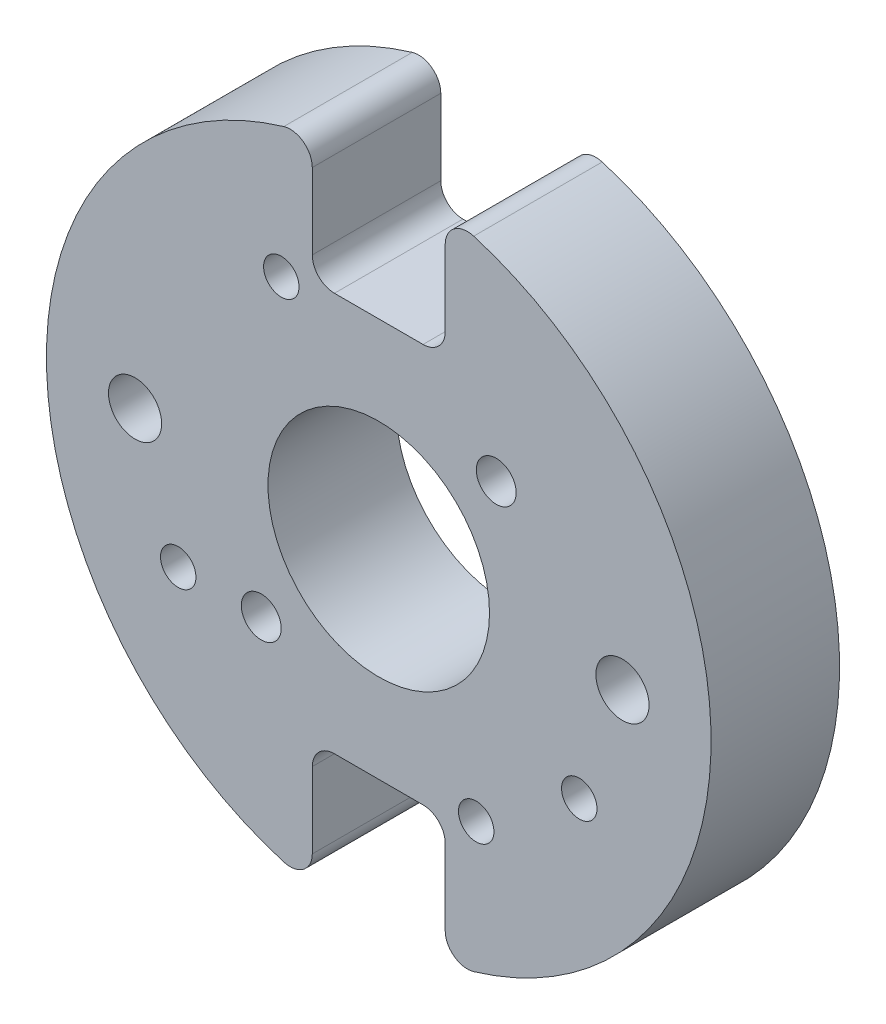
ISO-10303-21;
HEADER;
FILE_DESCRIPTION(('STEP AP214'),'2;1');
FILE_NAME('part.step','',(''),(''),'','','');
FILE_SCHEMA(('AUTOMOTIVE_DESIGN { 1 0 10303 214 1 1 1 1 }'));
ENDSEC;
DATA;
#1=APPLICATION_CONTEXT('core data for automotive mechanical design processes');
#2=APPLICATION_PROTOCOL_DEFINITION('international standard','automotive_design',2000,#1);
#3=PRODUCT_CONTEXT('',#1,'mechanical');
#4=PRODUCT('Part','Part','',(#3));
#5=PRODUCT_RELATED_PRODUCT_CATEGORY('part','',(#4));
#6=PRODUCT_DEFINITION_FORMATION('','',#4);
#7=PRODUCT_DEFINITION_CONTEXT('part definition',#1,'design');
#8=PRODUCT_DEFINITION('design','',#6,#7);
#9=PRODUCT_DEFINITION_SHAPE('','',#8);
#10=(LENGTH_UNIT() NAMED_UNIT(*) SI_UNIT(.MILLI.,.METRE.));
#11=(NAMED_UNIT(*) PLANE_ANGLE_UNIT() SI_UNIT($,.RADIAN.));
#12=(NAMED_UNIT(*) SI_UNIT($,.STERADIAN.) SOLID_ANGLE_UNIT());
#13=UNCERTAINTY_MEASURE_WITH_UNIT(LENGTH_MEASURE(1.E-05),#10,'distance_accuracy_value','');
#14=(GEOMETRIC_REPRESENTATION_CONTEXT(3) GLOBAL_UNCERTAINTY_ASSIGNED_CONTEXT((#13)) GLOBAL_UNIT_ASSIGNED_CONTEXT((#10,
#11,#12)) REPRESENTATION_CONTEXT('',''));
#15=CARTESIAN_POINT('',(0.,0.,0.));
#16=DIRECTION('',(0.,0.,1.));
#17=DIRECTION('',(1.,0.,0.));
#18=AXIS2_PLACEMENT_3D('',#15,#16,#17);
#19=CARTESIAN_POINT('',(0.,0.,0.));
#20=DIRECTION('',(0.,0.,1.));
#21=DIRECTION('',(1.,0.,0.));
#22=AXIS2_PLACEMENT_3D('',#19,#20,#21);
#23=PLANE('',#22);
#24=CARTESIAN_POINT('',(-9.05178412289533,-5.22605,0.));
#25=DIRECTION('',(0.,0.,-1.));
#26=DIRECTION('',(-1.,0.,0.));
#27=AXIS2_PLACEMENT_3D('',#24,#25,#26);
#28=CIRCLE('',#27,0.79999999999999);
#29=CARTESIAN_POINT('',(-9.85178412289532,-5.22605,0.));
#30=VERTEX_POINT('',#29);
#31=EDGE_CURVE('E411',#30,#30,#28,.T.);
#32=ORIENTED_EDGE('',*,*,#31,.F.);
#33=EDGE_LOOP('',(#32));
#34=FACE_BOUND('',#33,.T.);
#35=CARTESIAN_POINT('',(0.,0.,0.));
#36=DIRECTION('',(0.,0.,1.));
#37=DIRECTION('',(1.,0.,0.));
#38=AXIS2_PLACEMENT_3D('',#35,#36,#37);
#39=CIRCLE('',#38,5.);
#40=CARTESIAN_POINT('',(5.,0.,0.));
#41=VERTEX_POINT('',#40);
#42=EDGE_CURVE('E297',#41,#41,#39,.T.);
#43=ORIENTED_EDGE('',*,*,#42,.T.);
#44=EDGE_LOOP('',(#43));
#45=FACE_BOUND('',#44,.T.);
#46=CARTESIAN_POINT('',(11.,0.,0.));
#47=DIRECTION('',(0.,0.,1.));
#48=DIRECTION('',(1.,0.,0.));
#49=AXIS2_PLACEMENT_3D('',#46,#47,#48);
#50=CIRCLE('',#49,1.19999999999999);
#51=CARTESIAN_POINT('',(12.2,0.,0.));
#52=VERTEX_POINT('',#51);
#53=EDGE_CURVE('E294',#52,#52,#50,.T.);
#54=ORIENTED_EDGE('',*,*,#53,.T.);
#55=EDGE_LOOP('',(#54));
#56=FACE_BOUND('',#55,.T.);
#57=CARTESIAN_POINT('',(-11.,0.,0.));
#58=DIRECTION('',(0.,0.,1.));
#59=DIRECTION('',(1.,0.,0.));
#60=AXIS2_PLACEMENT_3D('',#57,#58,#59);
#61=CIRCLE('',#60,1.19999999999999);
#62=CARTESIAN_POINT('',(-9.8,0.,0.));
#63=VERTEX_POINT('',#62);
#64=EDGE_CURVE('E288',#63,#63,#61,.T.);
#65=ORIENTED_EDGE('',*,*,#64,.T.);
#66=EDGE_LOOP('',(#65));
#67=FACE_BOUND('',#66,.T.);
#68=CARTESIAN_POINT('',(-5.3033008588991,-5.30330085889912,0.));
#69=DIRECTION('',(0.,0.,1.));
#70=DIRECTION('',(1.,0.,0.));
#71=AXIS2_PLACEMENT_3D('',#68,#69,#70);
#72=CIRCLE('',#71,0.899999999999995);
#73=CARTESIAN_POINT('',(-4.4033008588991,-5.30330085889912,0.));
#74=VERTEX_POINT('',#73);
#75=EDGE_CURVE('E282',#74,#74,#72,.T.);
#76=ORIENTED_EDGE('',*,*,#75,.T.);
#77=EDGE_LOOP('',(#76));
#78=FACE_BOUND('',#77,.T.);
#79=CARTESIAN_POINT('',(5.3033008588991,5.30330085889912,0.));
#80=DIRECTION('',(0.,0.,1.));
#81=DIRECTION('',(1.,0.,0.));
#82=AXIS2_PLACEMENT_3D('',#79,#80,#81);
#83=CIRCLE('',#82,0.899999999999995);
#84=CARTESIAN_POINT('',(6.20330085889909,5.30330085889912,0.));
#85=VERTEX_POINT('',#84);
#86=EDGE_CURVE('E182',#85,#85,#83,.T.);
#87=ORIENTED_EDGE('',*,*,#86,.T.);
#88=EDGE_LOOP('',(#87));
#89=FACE_BOUND('',#88,.T.);
#90=DIRECTION('',(0.,1.,0.));
#91=VECTOR('',#90,1.);
#92=CARTESIAN_POINT('',(3.,15.,0.));
#93=LINE('',#92,#91);
#94=CARTESIAN_POINT('',(3.,10.,0.));
#95=VERTEX_POINT('',#94);
#96=CARTESIAN_POINT('',(3.,13.4164078649987,0.));
#97=VERTEX_POINT('',#96);
#98=EDGE_CURVE('E256',#95,#97,#93,.T.);
#99=ORIENTED_EDGE('',*,*,#98,.T.);
#100=CARTESIAN_POINT('',(4.,13.4164078649987,0.));
#101=DIRECTION('',(0.,0.,1.));
#102=DIRECTION('',(1.,0.,0.));
#103=AXIS2_PLACEMENT_3D('',#100,#101,#102);
#104=CIRCLE('',#103,1.);
#105=CARTESIAN_POINT('',(4.28571428571428,14.3747227124986,0.));
#106=VERTEX_POINT('',#105);
#107=EDGE_CURVE('E172',#97,#106,#104,.F.);
#108=ORIENTED_EDGE('',*,*,#107,.T.);
#109=CARTESIAN_POINT('',(0.,0.,0.));
#110=DIRECTION('',(0.,0.,1.));
#111=DIRECTION('',(1.,0.,0.));
#112=AXIS2_PLACEMENT_3D('',#109,#110,#111);
#113=CIRCLE('',#112,15.);
#114=CARTESIAN_POINT('',(4.28571428571428,-14.3747227124986,0.));
#115=VERTEX_POINT('',#114);
#116=EDGE_CURVE('E163',#115,#106,#113,.T.);
#117=ORIENTED_EDGE('',*,*,#116,.F.);
#118=CARTESIAN_POINT('',(4.,-13.4164078649987,0.));
#119=DIRECTION('',(0.,0.,1.));
#120=DIRECTION('',(1.,0.,0.));
#121=AXIS2_PLACEMENT_3D('',#118,#119,#120);
#122=CIRCLE('',#121,1.);
#123=CARTESIAN_POINT('',(3.,-13.4164078649987,0.));
#124=VERTEX_POINT('',#123);
#125=EDGE_CURVE('E147',#115,#124,#122,.F.);
#126=ORIENTED_EDGE('',*,*,#125,.T.);
#127=DIRECTION('',(0.,1.,0.));
#128=VECTOR('',#127,1.);
#129=CARTESIAN_POINT('',(3.,-15.,0.));
#130=LINE('',#129,#128);
#131=CARTESIAN_POINT('',(3.,-10.,0.));
#132=VERTEX_POINT('',#131);
#133=EDGE_CURVE('E263',#124,#132,#130,.T.);
#134=ORIENTED_EDGE('',*,*,#133,.T.);
#135=CARTESIAN_POINT('',(2.,-10.,0.));
#136=DIRECTION('',(0.,0.,1.));
#137=DIRECTION('',(1.,0.,0.));
#138=AXIS2_PLACEMENT_3D('',#135,#136,#137);
#139=CIRCLE('',#138,1.);
#140=CARTESIAN_POINT('',(2.,-9.,0.));
#141=VERTEX_POINT('',#140);
#142=EDGE_CURVE('E11',#132,#141,#139,.T.);
#143=ORIENTED_EDGE('',*,*,#142,.T.);
#144=DIRECTION('',(-1.,0.,0.));
#145=VECTOR('',#144,1.);
#146=CARTESIAN_POINT('',(-3.,-9.,0.));
#147=LINE('',#146,#145);
#148=CARTESIAN_POINT('',(-2.,-9.,0.));
#149=VERTEX_POINT('',#148);
#150=EDGE_CURVE('E261',#141,#149,#147,.T.);
#151=ORIENTED_EDGE('',*,*,#150,.T.);
#152=CARTESIAN_POINT('',(-2.,-10.,0.));
#153=DIRECTION('',(0.,0.,1.));
#154=DIRECTION('',(1.,0.,0.));
#155=AXIS2_PLACEMENT_3D('',#152,#153,#154);
#156=CIRCLE('',#155,1.);
#157=CARTESIAN_POINT('',(-3.,-10.,0.));
#158=VERTEX_POINT('',#157);
#159=EDGE_CURVE('E241',#149,#158,#156,.T.);
#160=ORIENTED_EDGE('',*,*,#159,.T.);
#161=DIRECTION('',(0.,-1.,0.));
#162=VECTOR('',#161,1.);
#163=CARTESIAN_POINT('',(-3.,-15.,0.));
#164=LINE('',#163,#162);
#165=CARTESIAN_POINT('',(-3.,-13.4164078649987,0.));
#166=VERTEX_POINT('',#165);
#167=EDGE_CURVE('E267',#158,#166,#164,.T.);
#168=ORIENTED_EDGE('',*,*,#167,.T.);
#169=CARTESIAN_POINT('',(-4.,-13.4164078649987,0.));
#170=DIRECTION('',(0.,0.,1.));
#171=DIRECTION('',(1.,0.,0.));
#172=AXIS2_PLACEMENT_3D('',#169,#170,#171);
#173=CIRCLE('',#172,1.);
#174=CARTESIAN_POINT('',(-4.28571428571428,-14.3747227124986,0.));
#175=VERTEX_POINT('',#174);
#176=EDGE_CURVE('E156',#166,#175,#173,.F.);
#177=ORIENTED_EDGE('',*,*,#176,.T.);
#178=CARTESIAN_POINT('',(-4.28571428571428,14.3747227124986,0.));
#179=VERTEX_POINT('',#178);
#180=EDGE_CURVE('E174',#179,#175,#113,.T.);
#181=ORIENTED_EDGE('',*,*,#180,.F.);
#182=CARTESIAN_POINT('',(-4.,13.4164078649987,0.));
#183=DIRECTION('',(0.,0.,1.));
#184=DIRECTION('',(1.,0.,0.));
#185=AXIS2_PLACEMENT_3D('',#182,#183,#184);
#186=CIRCLE('',#185,1.);
#187=CARTESIAN_POINT('',(-3.,13.4164078649987,0.));
#188=VERTEX_POINT('',#187);
#189=EDGE_CURVE('E56',#179,#188,#186,.F.);
#190=ORIENTED_EDGE('',*,*,#189,.T.);
#191=DIRECTION('',(0.,-1.,0.));
#192=VECTOR('',#191,1.);
#193=CARTESIAN_POINT('',(-3.,15.,0.));
#194=LINE('',#193,#192);
#195=CARTESIAN_POINT('',(-3.,10.,0.));
#196=VERTEX_POINT('',#195);
#197=EDGE_CURVE('E372',#188,#196,#194,.T.);
#198=ORIENTED_EDGE('',*,*,#197,.T.);
#199=CARTESIAN_POINT('',(-2.,10.,0.));
#200=DIRECTION('',(0.,0.,1.));
#201=DIRECTION('',(1.,0.,0.));
#202=AXIS2_PLACEMENT_3D('',#199,#200,#201);
#203=CIRCLE('',#202,1.);
#204=CARTESIAN_POINT('',(-2.,9.,0.));
#205=VERTEX_POINT('',#204);
#206=EDGE_CURVE('E237',#196,#205,#203,.T.);
#207=ORIENTED_EDGE('',*,*,#206,.T.);
#208=DIRECTION('',(1.,0.,0.));
#209=VECTOR('',#208,1.);
#210=CARTESIAN_POINT('',(-3.,9.,0.));
#211=LINE('',#210,#209);
#212=CARTESIAN_POINT('',(2.,9.,0.));
#213=VERTEX_POINT('',#212);
#214=EDGE_CURVE('E389',#205,#213,#211,.T.);
#215=ORIENTED_EDGE('',*,*,#214,.T.);
#216=CARTESIAN_POINT('',(2.,10.,0.));
#217=DIRECTION('',(0.,0.,1.));
#218=DIRECTION('',(1.,0.,0.));
#219=AXIS2_PLACEMENT_3D('',#216,#217,#218);
#220=CIRCLE('',#219,1.);
#221=EDGE_CURVE('E233',#213,#95,#220,.T.);
#222=ORIENTED_EDGE('',*,*,#221,.T.);
#223=EDGE_LOOP('',(#99,#108,#117,#126,#134,#143,#151,#160,#168,#177,#181,#190,#198,#207,#215,#222));
#224=FACE_BOUND('',#223,.T.);
#225=CARTESIAN_POINT('',(4.39815554106365,-8.44877818602259,0.));
#226=DIRECTION('',(0.,0.,1.));
#227=DIRECTION('',(1.,0.,0.));
#228=AXIS2_PLACEMENT_3D('',#225,#226,#227);
#229=CIRCLE('',#228,0.799999999999999);
#230=CARTESIAN_POINT('',(5.19815554106365,-8.44877818602259,0.));
#231=VERTEX_POINT('',#230);
#232=EDGE_CURVE('E375',#231,#231,#229,.T.);
#233=ORIENTED_EDGE('',*,*,#232,.T.);
#234=EDGE_LOOP('',(#233));
#235=FACE_BOUND('',#234,.T.);
#236=CARTESIAN_POINT('',(-4.39815554106365,8.44877818602259,0.));
#237=DIRECTION('',(0.,0.,1.));
#238=DIRECTION('',(1.,0.,0.));
#239=AXIS2_PLACEMENT_3D('',#236,#237,#238);
#240=CIRCLE('',#239,0.799999999999999);
#241=CARTESIAN_POINT('',(-3.59815554106365,8.44877818602259,0.));
#242=VERTEX_POINT('',#241);
#243=EDGE_CURVE('E396',#242,#242,#240,.T.);
#244=ORIENTED_EDGE('',*,*,#243,.T.);
#245=EDGE_LOOP('',(#244));
#246=FACE_BOUND('',#245,.T.);
#247=CARTESIAN_POINT('',(9.05178412289533,-5.22605,0.));
#248=DIRECTION('',(0.,0.,-1.));
#249=DIRECTION('',(-1.,0.,0.));
#250=AXIS2_PLACEMENT_3D('',#247,#248,#249);
#251=CIRCLE('',#250,0.79999999999999);
#252=CARTESIAN_POINT('',(8.25178412289534,-5.22605,0.));
#253=VERTEX_POINT('',#252);
#254=EDGE_CURVE('E405',#253,#253,#251,.T.);
#255=ORIENTED_EDGE('',*,*,#254,.F.);
#256=EDGE_LOOP('',(#255));
#257=FACE_BOUND('',#256,.T.);
#258=ADVANCED_FACE('F34',(#34,#45,#56,#67,#78,#89,#224,#235,#246,#257),#23,.F.);
#259=CARTESIAN_POINT('',(0.,0.,5.8));
#260=DIRECTION('',(0.,0.,-1.));
#261=DIRECTION('',(-1.,0.,0.));
#262=AXIS2_PLACEMENT_3D('',#259,#260,#261);
#263=CYLINDRICAL_SURFACE('',#262,15.);
#264=ORIENTED_EDGE('',*,*,#116,.T.);
#265=DIRECTION('',(0.,0.,-1.));
#266=VECTOR('',#265,1.);
#267=CARTESIAN_POINT('',(4.28571428571428,14.3747227124987,5.8));
#268=LINE('',#267,#266);
#269=CARTESIAN_POINT('',(4.28571428571428,14.3747227124986,5.8));
#270=VERTEX_POINT('',#269);
#271=EDGE_CURVE('E167',#106,#270,#268,.F.);
#272=ORIENTED_EDGE('',*,*,#271,.T.);
#273=CARTESIAN_POINT('',(0.,0.,5.8));
#274=DIRECTION('',(0.,0.,1.));
#275=DIRECTION('',(1.,0.,0.));
#276=AXIS2_PLACEMENT_3D('',#273,#274,#275);
#277=CIRCLE('',#276,15.);
#278=CARTESIAN_POINT('',(4.28571428571428,-14.3747227124986,5.8));
#279=VERTEX_POINT('',#278);
#280=EDGE_CURVE('E166',#279,#270,#277,.T.);
#281=ORIENTED_EDGE('',*,*,#280,.F.);
#282=DIRECTION('',(0.,0.,-1.));
#283=VECTOR('',#282,1.);
#284=CARTESIAN_POINT('',(4.28571428571428,-14.3747227124987,5.8));
#285=LINE('',#284,#283);
#286=EDGE_CURVE('E151',#279,#115,#285,.T.);
#287=ORIENTED_EDGE('',*,*,#286,.T.);
#288=EDGE_LOOP('',(#264,#272,#281,#287));
#289=FACE_BOUND('',#288,.T.);
#290=ADVANCED_FACE('F161',(#289),#263,.T.);
#291=CARTESIAN_POINT('',(0.,0.,5.8));
#292=DIRECTION('',(0.,0.,1.));
#293=DIRECTION('',(1.,0.,0.));
#294=AXIS2_PLACEMENT_3D('',#291,#292,#293);
#295=PLANE('',#294);
#296=CARTESIAN_POINT('',(-9.05178412289533,-5.22605,5.8));
#297=DIRECTION('',(0.,0.,1.));
#298=DIRECTION('',(1.,0.,0.));
#299=AXIS2_PLACEMENT_3D('',#296,#297,#298);
#300=CIRCLE('',#299,0.799999999999989);
#301=CARTESIAN_POINT('',(-8.25178412289534,-5.22605,5.8));
#302=VERTEX_POINT('',#301);
#303=EDGE_CURVE('E408',#302,#302,#300,.T.);
#304=ORIENTED_EDGE('',*,*,#303,.F.);
#305=EDGE_LOOP('',(#304));
#306=FACE_BOUND('',#305,.T.);
#307=CARTESIAN_POINT('',(9.05178412289533,-5.22605,5.8));
#308=DIRECTION('',(0.,0.,1.));
#309=DIRECTION('',(1.,0.,0.));
#310=AXIS2_PLACEMENT_3D('',#307,#308,#309);
#311=CIRCLE('',#310,0.799999999999989);
#312=CARTESIAN_POINT('',(9.85178412289532,-5.22605,5.8));
#313=VERTEX_POINT('',#312);
#314=EDGE_CURVE('E402',#313,#313,#311,.T.);
#315=ORIENTED_EDGE('',*,*,#314,.F.);
#316=EDGE_LOOP('',(#315));
#317=FACE_BOUND('',#316,.T.);
#318=CARTESIAN_POINT('',(-4.39815554106365,8.44877818602259,5.8));
#319=DIRECTION('',(0.,0.,1.));
#320=DIRECTION('',(1.,0.,0.));
#321=AXIS2_PLACEMENT_3D('',#318,#319,#320);
#322=CIRCLE('',#321,0.799999999999999);
#323=CARTESIAN_POINT('',(-3.59815554106365,8.44877818602259,5.8));
#324=VERTEX_POINT('',#323);
#325=EDGE_CURVE('E399',#324,#324,#322,.T.);
#326=ORIENTED_EDGE('',*,*,#325,.F.);
#327=EDGE_LOOP('',(#326));
#328=FACE_BOUND('',#327,.T.);
#329=CARTESIAN_POINT('',(4.39815554106365,-8.44877818602259,5.8));
#330=DIRECTION('',(0.,0.,1.));
#331=DIRECTION('',(1.,0.,0.));
#332=AXIS2_PLACEMENT_3D('',#329,#330,#331);
#333=CIRCLE('',#332,0.799999999999999);
#334=CARTESIAN_POINT('',(5.19815554106365,-8.44877818602259,5.8));
#335=VERTEX_POINT('',#334);
#336=EDGE_CURVE('E381',#335,#335,#333,.T.);
#337=ORIENTED_EDGE('',*,*,#336,.F.);
#338=EDGE_LOOP('',(#337));
#339=FACE_BOUND('',#338,.T.);
#340=ORIENTED_EDGE('',*,*,#280,.T.);
#341=CARTESIAN_POINT('',(4.,13.4164078649987,5.8));
#342=DIRECTION('',(0.,0.,1.));
#343=DIRECTION('',(1.,0.,0.));
#344=AXIS2_PLACEMENT_3D('',#341,#342,#343);
#345=CIRCLE('',#344,1.);
#346=CARTESIAN_POINT('',(3.,13.4164078649987,5.8));
#347=VERTEX_POINT('',#346);
#348=EDGE_CURVE('E194',#270,#347,#345,.T.);
#349=ORIENTED_EDGE('',*,*,#348,.T.);
#350=DIRECTION('',(0.,1.,0.));
#351=VECTOR('',#350,1.);
#352=CARTESIAN_POINT('',(3.,15.,5.8));
#353=LINE('',#352,#351);
#354=CARTESIAN_POINT('',(3.,10.,5.8));
#355=VERTEX_POINT('',#354);
#356=EDGE_CURVE('E378',#355,#347,#353,.T.);
#357=ORIENTED_EDGE('',*,*,#356,.F.);
#358=CARTESIAN_POINT('',(2.,10.,5.8));
#359=DIRECTION('',(0.,0.,1.));
#360=DIRECTION('',(1.,0.,0.));
#361=AXIS2_PLACEMENT_3D('',#358,#359,#360);
#362=CIRCLE('',#361,1.);
#363=CARTESIAN_POINT('',(2.,9.,5.8));
#364=VERTEX_POINT('',#363);
#365=EDGE_CURVE('E231',#355,#364,#362,.F.);
#366=ORIENTED_EDGE('',*,*,#365,.T.);
#367=DIRECTION('',(1.,0.,0.));
#368=VECTOR('',#367,1.);
#369=CARTESIAN_POINT('',(-3.,9.,5.8));
#370=LINE('',#369,#368);
#371=CARTESIAN_POINT('',(-2.,9.,5.8));
#372=VERTEX_POINT('',#371);
#373=EDGE_CURVE('E374',#372,#364,#370,.T.);
#374=ORIENTED_EDGE('',*,*,#373,.F.);
#375=CARTESIAN_POINT('',(-2.,10.,5.8));
#376=DIRECTION('',(0.,0.,1.));
#377=DIRECTION('',(1.,0.,0.));
#378=AXIS2_PLACEMENT_3D('',#375,#376,#377);
#379=CIRCLE('',#378,1.);
#380=CARTESIAN_POINT('',(-3.,10.,5.8));
#381=VERTEX_POINT('',#380);
#382=EDGE_CURVE('E235',#372,#381,#379,.F.);
#383=ORIENTED_EDGE('',*,*,#382,.T.);
#384=DIRECTION('',(0.,-1.,0.));
#385=VECTOR('',#384,1.);
#386=CARTESIAN_POINT('',(-3.,15.,5.8));
#387=LINE('',#386,#385);
#388=CARTESIAN_POINT('',(-3.,13.4164078649987,5.8));
#389=VERTEX_POINT('',#388);
#390=EDGE_CURVE('E371',#389,#381,#387,.T.);
#391=ORIENTED_EDGE('',*,*,#390,.F.);
#392=CARTESIAN_POINT('',(-4.,13.4164078649987,5.8));
#393=DIRECTION('',(0.,0.,1.));
#394=DIRECTION('',(1.,0.,0.));
#395=AXIS2_PLACEMENT_3D('',#392,#393,#394);
#396=CIRCLE('',#395,1.);
#397=CARTESIAN_POINT('',(-4.28571428571428,14.3747227124986,5.8));
#398=VERTEX_POINT('',#397);
#399=EDGE_CURVE('E192',#389,#398,#396,.T.);
#400=ORIENTED_EDGE('',*,*,#399,.T.);
#401=CARTESIAN_POINT('',(-4.28571428571428,-14.3747227124986,5.8));
#402=VERTEX_POINT('',#401);
#403=EDGE_CURVE('E173',#398,#402,#277,.T.);
#404=ORIENTED_EDGE('',*,*,#403,.T.);
#405=CARTESIAN_POINT('',(-4.,-13.4164078649987,5.8));
#406=DIRECTION('',(0.,0.,1.));
#407=DIRECTION('',(1.,0.,0.));
#408=AXIS2_PLACEMENT_3D('',#405,#406,#407);
#409=CIRCLE('',#408,1.);
#410=CARTESIAN_POINT('',(-3.,-13.4164078649987,5.8));
#411=VERTEX_POINT('',#410);
#412=EDGE_CURVE('E188',#402,#411,#409,.T.);
#413=ORIENTED_EDGE('',*,*,#412,.T.);
#414=DIRECTION('',(0.,-1.,0.));
#415=VECTOR('',#414,1.);
#416=CARTESIAN_POINT('',(-3.,-15.,5.8));
#417=LINE('',#416,#415);
#418=CARTESIAN_POINT('',(-3.,-10.,5.8));
#419=VERTEX_POINT('',#418);
#420=EDGE_CURVE('E271',#419,#411,#417,.T.);
#421=ORIENTED_EDGE('',*,*,#420,.F.);
#422=CARTESIAN_POINT('',(-2.,-10.,5.8));
#423=DIRECTION('',(0.,0.,1.));
#424=DIRECTION('',(1.,0.,0.));
#425=AXIS2_PLACEMENT_3D('',#422,#423,#424);
#426=CIRCLE('',#425,1.);
#427=CARTESIAN_POINT('',(-2.,-9.,5.8));
#428=VERTEX_POINT('',#427);
#429=EDGE_CURVE('E239',#419,#428,#426,.F.);
#430=ORIENTED_EDGE('',*,*,#429,.T.);
#431=DIRECTION('',(-1.,0.,0.));
#432=VECTOR('',#431,1.);
#433=CARTESIAN_POINT('',(-3.,-9.,5.8));
#434=LINE('',#433,#432);
#435=CARTESIAN_POINT('',(2.,-9.,5.8));
#436=VERTEX_POINT('',#435);
#437=EDGE_CURVE('E250',#436,#428,#434,.T.);
#438=ORIENTED_EDGE('',*,*,#437,.F.);
#439=CARTESIAN_POINT('',(2.,-10.,5.8));
#440=DIRECTION('',(0.,0.,1.));
#441=DIRECTION('',(1.,0.,0.));
#442=AXIS2_PLACEMENT_3D('',#439,#440,#441);
#443=CIRCLE('',#442,1.);
#444=CARTESIAN_POINT('',(3.,-10.,5.8));
#445=VERTEX_POINT('',#444);
#446=EDGE_CURVE('E42',#436,#445,#443,.F.);
#447=ORIENTED_EDGE('',*,*,#446,.T.);
#448=DIRECTION('',(0.,1.,0.));
#449=VECTOR('',#448,1.);
#450=CARTESIAN_POINT('',(3.,-15.,5.8));
#451=LINE('',#450,#449);
#452=CARTESIAN_POINT('',(3.,-13.4164078649987,5.8));
#453=VERTEX_POINT('',#452);
#454=EDGE_CURVE('E248',#453,#445,#451,.T.);
#455=ORIENTED_EDGE('',*,*,#454,.F.);
#456=CARTESIAN_POINT('',(4.,-13.4164078649987,5.8));
#457=DIRECTION('',(0.,0.,1.));
#458=DIRECTION('',(1.,0.,0.));
#459=AXIS2_PLACEMENT_3D('',#456,#457,#458);
#460=CIRCLE('',#459,1.);
#461=EDGE_CURVE('E190',#453,#279,#460,.T.);
#462=ORIENTED_EDGE('',*,*,#461,.T.);
#463=EDGE_LOOP('',(#340,#349,#357,#366,#374,#383,#391,#400,#404,#413,#421,#430,#438,#447,#455,#462));
#464=FACE_BOUND('',#463,.T.);
#465=CARTESIAN_POINT('',(5.3033008588991,5.30330085889912,5.8));
#466=DIRECTION('',(0.,0.,1.));
#467=DIRECTION('',(1.,0.,0.));
#468=AXIS2_PLACEMENT_3D('',#465,#466,#467);
#469=CIRCLE('',#468,0.899999999999997);
#470=CARTESIAN_POINT('',(6.20330085889909,5.30330085889912,5.8));
#471=VERTEX_POINT('',#470);
#472=EDGE_CURVE('E185',#471,#471,#469,.T.);
#473=ORIENTED_EDGE('',*,*,#472,.F.);
#474=EDGE_LOOP('',(#473));
#475=FACE_BOUND('',#474,.T.);
#476=CARTESIAN_POINT('',(-5.3033008588991,-5.30330085889912,5.8));
#477=DIRECTION('',(0.,0.,1.));
#478=DIRECTION('',(1.,0.,0.));
#479=AXIS2_PLACEMENT_3D('',#476,#477,#478);
#480=CIRCLE('',#479,0.899999999999997);
#481=CARTESIAN_POINT('',(-4.4033008588991,-5.30330085889912,5.8));
#482=VERTEX_POINT('',#481);
#483=EDGE_CURVE('E184',#482,#482,#480,.T.);
#484=ORIENTED_EDGE('',*,*,#483,.F.);
#485=EDGE_LOOP('',(#484));
#486=FACE_BOUND('',#485,.T.);
#487=CARTESIAN_POINT('',(-11.,0.,5.8));
#488=DIRECTION('',(0.,0.,1.));
#489=DIRECTION('',(1.,0.,0.));
#490=AXIS2_PLACEMENT_3D('',#487,#488,#489);
#491=CIRCLE('',#490,1.2);
#492=CARTESIAN_POINT('',(-9.8,0.,5.8));
#493=VERTEX_POINT('',#492);
#494=EDGE_CURVE('E285',#493,#493,#491,.T.);
#495=ORIENTED_EDGE('',*,*,#494,.F.);
#496=EDGE_LOOP('',(#495));
#497=FACE_BOUND('',#496,.T.);
#498=CARTESIAN_POINT('',(11.,0.,5.8));
#499=DIRECTION('',(0.,0.,1.));
#500=DIRECTION('',(1.,0.,0.));
#501=AXIS2_PLACEMENT_3D('',#498,#499,#500);
#502=CIRCLE('',#501,1.2);
#503=CARTESIAN_POINT('',(12.2,0.,5.8));
#504=VERTEX_POINT('',#503);
#505=EDGE_CURVE('E291',#504,#504,#502,.T.);
#506=ORIENTED_EDGE('',*,*,#505,.F.);
#507=EDGE_LOOP('',(#506));
#508=FACE_BOUND('',#507,.T.);
#509=CARTESIAN_POINT('',(0.,0.,5.8));
#510=DIRECTION('',(0.,0.,1.));
#511=DIRECTION('',(1.,0.,0.));
#512=AXIS2_PLACEMENT_3D('',#509,#510,#511);
#513=CIRCLE('',#512,5.);
#514=CARTESIAN_POINT('',(5.,0.,5.8));
#515=VERTEX_POINT('',#514);
#516=EDGE_CURVE('E179',#515,#515,#513,.T.);
#517=ORIENTED_EDGE('',*,*,#516,.F.);
#518=EDGE_LOOP('',(#517));
#519=FACE_BOUND('',#518,.T.);
#520=ADVANCED_FACE('F246',(#306,#317,#328,#339,#464,#475,#486,#497,#508,#519),#295,.T.);
#521=ORIENTED_EDGE('',*,*,#403,.F.);
#522=DIRECTION('',(0.,0.,-1.));
#523=VECTOR('',#522,1.);
#524=CARTESIAN_POINT('',(-4.28571428571428,14.3747227124987,5.8));
#525=LINE('',#524,#523);
#526=EDGE_CURVE('E215',#398,#179,#525,.T.);
#527=ORIENTED_EDGE('',*,*,#526,.T.);
#528=ORIENTED_EDGE('',*,*,#180,.T.);
#529=DIRECTION('',(0.,0.,-1.));
#530=VECTOR('',#529,1.);
#531=CARTESIAN_POINT('',(-4.28571428571428,-14.3747227124987,5.8));
#532=LINE('',#531,#530);
#533=EDGE_CURVE('E212',#175,#402,#532,.F.);
#534=ORIENTED_EDGE('',*,*,#533,.T.);
#535=EDGE_LOOP('',(#521,#527,#528,#534));
#536=FACE_BOUND('',#535,.T.);
#537=ADVANCED_FACE('F307',(#536),#263,.T.);
#538=CARTESIAN_POINT('',(0.,0.,5.8));
#539=DIRECTION('',(0.,0.,-1.));
#540=DIRECTION('',(-1.,0.,0.));
#541=AXIS2_PLACEMENT_3D('',#538,#539,#540);
#542=CYLINDRICAL_SURFACE('',#541,5.);
#543=ORIENTED_EDGE('',*,*,#516,.T.);
#544=EDGE_LOOP('',(#543));
#545=FACE_BOUND('',#544,.T.);
#546=ORIENTED_EDGE('',*,*,#42,.F.);
#547=EDGE_LOOP('',(#546));
#548=FACE_BOUND('',#547,.T.);
#549=ADVANCED_FACE('F304',(#545,#548),#542,.F.);
#550=CARTESIAN_POINT('',(11.,0.,5.8));
#551=DIRECTION('',(0.,0.,1.));
#552=DIRECTION('',(1.,0.,0.));
#553=AXIS2_PLACEMENT_3D('',#550,#551,#552);
#554=CYLINDRICAL_SURFACE('',#553,1.19999999999999);
#555=ORIENTED_EDGE('',*,*,#505,.T.);
#556=EDGE_LOOP('',(#555));
#557=FACE_BOUND('',#556,.T.);
#558=ORIENTED_EDGE('',*,*,#53,.F.);
#559=EDGE_LOOP('',(#558));
#560=FACE_BOUND('',#559,.T.);
#561=ADVANCED_FACE('F306',(#557,#560),#554,.F.);
#562=CARTESIAN_POINT('',(-11.,0.,5.8));
#563=DIRECTION('',(0.,0.,1.));
#564=DIRECTION('',(1.,0.,0.));
#565=AXIS2_PLACEMENT_3D('',#562,#563,#564);
#566=CYLINDRICAL_SURFACE('',#565,1.19999999999999);
#567=ORIENTED_EDGE('',*,*,#494,.T.);
#568=EDGE_LOOP('',(#567));
#569=FACE_BOUND('',#568,.T.);
#570=ORIENTED_EDGE('',*,*,#64,.F.);
#571=EDGE_LOOP('',(#570));
#572=FACE_BOUND('',#571,.T.);
#573=ADVANCED_FACE('F314',(#569,#572),#566,.F.);
#574=CARTESIAN_POINT('',(-5.3033008588991,-5.30330085889912,5.8));
#575=DIRECTION('',(0.,0.,1.));
#576=DIRECTION('',(1.,0.,0.));
#577=AXIS2_PLACEMENT_3D('',#574,#575,#576);
#578=CYLINDRICAL_SURFACE('',#577,0.899999999999995);
#579=ORIENTED_EDGE('',*,*,#483,.T.);
#580=EDGE_LOOP('',(#579));
#581=FACE_BOUND('',#580,.T.);
#582=ORIENTED_EDGE('',*,*,#75,.F.);
#583=EDGE_LOOP('',(#582));
#584=FACE_BOUND('',#583,.T.);
#585=ADVANCED_FACE('F449',(#581,#584),#578,.F.);
#586=CARTESIAN_POINT('',(5.3033008588991,5.30330085889912,5.8));
#587=DIRECTION('',(0.,0.,1.));
#588=DIRECTION('',(1.,0.,0.));
#589=AXIS2_PLACEMENT_3D('',#586,#587,#588);
#590=CYLINDRICAL_SURFACE('',#589,0.899999999999995);
#591=ORIENTED_EDGE('',*,*,#472,.T.);
#592=EDGE_LOOP('',(#591));
#593=FACE_BOUND('',#592,.T.);
#594=ORIENTED_EDGE('',*,*,#86,.F.);
#595=EDGE_LOOP('',(#594));
#596=FACE_BOUND('',#595,.T.);
#597=ADVANCED_FACE('F446',(#593,#596),#590,.F.);
#598=CARTESIAN_POINT('',(3.,-15.,0.));
#599=DIRECTION('',(1.,0.,0.));
#600=DIRECTION('',(0.,0.,-1.));
#601=AXIS2_PLACEMENT_3D('',#598,#599,#600);
#602=PLANE('',#601);
#603=ORIENTED_EDGE('',*,*,#133,.F.);
#604=DIRECTION('',(0.,0.,-1.));
#605=VECTOR('',#604,1.);
#606=CARTESIAN_POINT('',(3.,-13.4164078649987,0.));
#607=LINE('',#606,#605);
#608=EDGE_CURVE('E152',#124,#453,#607,.F.);
#609=ORIENTED_EDGE('',*,*,#608,.T.);
#610=ORIENTED_EDGE('',*,*,#454,.T.);
#611=DIRECTION('',(0.,0.,1.));
#612=VECTOR('',#611,1.);
#613=CARTESIAN_POINT('',(3.,-10.,0.));
#614=LINE('',#613,#612);
#615=EDGE_CURVE('E218',#445,#132,#614,.F.);
#616=ORIENTED_EDGE('',*,*,#615,.T.);
#617=EDGE_LOOP('',(#603,#609,#610,#616));
#618=FACE_BOUND('',#617,.T.);
#619=ADVANCED_FACE('F255',(#618),#602,.F.);
#620=CARTESIAN_POINT('',(-3.,-15.,0.));
#621=DIRECTION('',(-1.,0.,0.));
#622=DIRECTION('',(0.,0.,1.));
#623=AXIS2_PLACEMENT_3D('',#620,#621,#622);
#624=PLANE('',#623);
#625=ORIENTED_EDGE('',*,*,#420,.T.);
#626=DIRECTION('',(0.,0.,-1.));
#627=VECTOR('',#626,1.);
#628=CARTESIAN_POINT('',(-3.,-13.4164078649987,0.));
#629=LINE('',#628,#627);
#630=EDGE_CURVE('E224',#411,#166,#629,.T.);
#631=ORIENTED_EDGE('',*,*,#630,.T.);
#632=ORIENTED_EDGE('',*,*,#167,.F.);
#633=DIRECTION('',(0.,0.,1.));
#634=VECTOR('',#633,1.);
#635=CARTESIAN_POINT('',(-3.,-10.,5.8));
#636=LINE('',#635,#634);
#637=EDGE_CURVE('E221',#158,#419,#636,.T.);
#638=ORIENTED_EDGE('',*,*,#637,.T.);
#639=EDGE_LOOP('',(#625,#631,#632,#638));
#640=FACE_BOUND('',#639,.T.);
#641=ADVANCED_FACE('F361',(#640),#624,.F.);
#642=CARTESIAN_POINT('',(-3.,-9.,0.));
#643=DIRECTION('',(0.,1.,0.));
#644=DIRECTION('',(0.,0.,1.));
#645=AXIS2_PLACEMENT_3D('',#642,#643,#644);
#646=PLANE('',#645);
#647=ORIENTED_EDGE('',*,*,#437,.T.);
#648=DIRECTION('',(0.,0.,1.));
#649=VECTOR('',#648,1.);
#650=CARTESIAN_POINT('',(-2.,-9.,0.));
#651=LINE('',#650,#649);
#652=EDGE_CURVE('E229',#428,#149,#651,.F.);
#653=ORIENTED_EDGE('',*,*,#652,.T.);
#654=ORIENTED_EDGE('',*,*,#150,.F.);
#655=DIRECTION('',(0.,0.,1.));
#656=VECTOR('',#655,1.);
#657=CARTESIAN_POINT('',(2.,-9.,5.8));
#658=LINE('',#657,#656);
#659=EDGE_CURVE('E226',#141,#436,#658,.T.);
#660=ORIENTED_EDGE('',*,*,#659,.T.);
#661=EDGE_LOOP('',(#647,#653,#654,#660));
#662=FACE_BOUND('',#661,.T.);
#663=ADVANCED_FACE('F265',(#662),#646,.F.);
#664=CARTESIAN_POINT('',(3.,15.,0.));
#665=DIRECTION('',(1.,0.,0.));
#666=DIRECTION('',(0.,0.,-1.));
#667=AXIS2_PLACEMENT_3D('',#664,#665,#666);
#668=PLANE('',#667);
#669=ORIENTED_EDGE('',*,*,#356,.T.);
#670=DIRECTION('',(0.,0.,-1.));
#671=VECTOR('',#670,1.);
#672=CARTESIAN_POINT('',(3.,13.4164078649987,0.));
#673=LINE('',#672,#671);
#674=EDGE_CURVE('E199',#347,#97,#673,.T.);
#675=ORIENTED_EDGE('',*,*,#674,.T.);
#676=ORIENTED_EDGE('',*,*,#98,.F.);
#677=DIRECTION('',(0.,0.,1.));
#678=VECTOR('',#677,1.);
#679=CARTESIAN_POINT('',(3.,10.,5.8));
#680=LINE('',#679,#678);
#681=EDGE_CURVE('E196',#95,#355,#680,.T.);
#682=ORIENTED_EDGE('',*,*,#681,.T.);
#683=EDGE_LOOP('',(#669,#675,#676,#682));
#684=FACE_BOUND('',#683,.T.);
#685=ADVANCED_FACE('F432',(#684),#668,.F.);
#686=CARTESIAN_POINT('',(-3.,15.,0.));
#687=DIRECTION('',(-1.,0.,0.));
#688=DIRECTION('',(0.,0.,1.));
#689=AXIS2_PLACEMENT_3D('',#686,#687,#688);
#690=PLANE('',#689);
#691=ORIENTED_EDGE('',*,*,#390,.T.);
#692=DIRECTION('',(0.,0.,1.));
#693=VECTOR('',#692,1.);
#694=CARTESIAN_POINT('',(-3.,10.,0.));
#695=LINE('',#694,#693);
#696=EDGE_CURVE('E49',#381,#196,#695,.F.);
#697=ORIENTED_EDGE('',*,*,#696,.T.);
#698=ORIENTED_EDGE('',*,*,#197,.F.);
#699=DIRECTION('',(0.,0.,-1.));
#700=VECTOR('',#699,1.);
#701=CARTESIAN_POINT('',(-3.,13.4164078649987,0.));
#702=LINE('',#701,#700);
#703=EDGE_CURVE('E209',#188,#389,#702,.F.);
#704=ORIENTED_EDGE('',*,*,#703,.T.);
#705=EDGE_LOOP('',(#691,#697,#698,#704));
#706=FACE_BOUND('',#705,.T.);
#707=ADVANCED_FACE('F370',(#706),#690,.F.);
#708=CARTESIAN_POINT('',(-3.,9.,0.));
#709=DIRECTION('',(0.,-1.,0.));
#710=DIRECTION('',(0.,0.,-1.));
#711=AXIS2_PLACEMENT_3D('',#708,#709,#710);
#712=PLANE('',#711);
#713=ORIENTED_EDGE('',*,*,#373,.T.);
#714=DIRECTION('',(0.,0.,1.));
#715=VECTOR('',#714,1.);
#716=CARTESIAN_POINT('',(2.,9.,0.));
#717=LINE('',#716,#715);
#718=EDGE_CURVE('E207',#364,#213,#717,.F.);
#719=ORIENTED_EDGE('',*,*,#718,.T.);
#720=ORIENTED_EDGE('',*,*,#214,.F.);
#721=DIRECTION('',(0.,0.,1.));
#722=VECTOR('',#721,1.);
#723=CARTESIAN_POINT('',(-2.,9.,5.8));
#724=LINE('',#723,#722);
#725=EDGE_CURVE('E204',#205,#372,#724,.T.);
#726=ORIENTED_EDGE('',*,*,#725,.T.);
#727=EDGE_LOOP('',(#713,#719,#720,#726));
#728=FACE_BOUND('',#727,.T.);
#729=ADVANCED_FACE('F332',(#728),#712,.F.);
#730=CARTESIAN_POINT('',(4.,13.4164078649987,5.8));
#731=DIRECTION('',(0.,0.,-1.));
#732=DIRECTION('',(-1.,0.,0.));
#733=AXIS2_PLACEMENT_3D('',#730,#731,#732);
#734=CYLINDRICAL_SURFACE('',#733,1.);
#735=ORIENTED_EDGE('',*,*,#107,.F.);
#736=ORIENTED_EDGE('',*,*,#674,.F.);
#737=ORIENTED_EDGE('',*,*,#348,.F.);
#738=ORIENTED_EDGE('',*,*,#271,.F.);
#739=EDGE_LOOP('',(#735,#736,#737,#738));
#740=FACE_BOUND('',#739,.T.);
#741=ADVANCED_FACE('F328',(#740),#734,.T.);
#742=CARTESIAN_POINT('',(2.,10.,0.));
#743=DIRECTION('',(0.,0.,-1.));
#744=DIRECTION('',(-1.,0.,0.));
#745=AXIS2_PLACEMENT_3D('',#742,#743,#744);
#746=CYLINDRICAL_SURFACE('',#745,1.);
#747=ORIENTED_EDGE('',*,*,#221,.F.);
#748=ORIENTED_EDGE('',*,*,#718,.F.);
#749=ORIENTED_EDGE('',*,*,#365,.F.);
#750=ORIENTED_EDGE('',*,*,#681,.F.);
#751=EDGE_LOOP('',(#747,#748,#749,#750));
#752=FACE_BOUND('',#751,.T.);
#753=ADVANCED_FACE('F331',(#752),#746,.F.);
#754=CARTESIAN_POINT('',(-2.,10.,0.));
#755=DIRECTION('',(0.,0.,-1.));
#756=DIRECTION('',(-1.,0.,0.));
#757=AXIS2_PLACEMENT_3D('',#754,#755,#756);
#758=CYLINDRICAL_SURFACE('',#757,1.);
#759=ORIENTED_EDGE('',*,*,#206,.F.);
#760=ORIENTED_EDGE('',*,*,#696,.F.);
#761=ORIENTED_EDGE('',*,*,#382,.F.);
#762=ORIENTED_EDGE('',*,*,#725,.F.);
#763=EDGE_LOOP('',(#759,#760,#761,#762));
#764=FACE_BOUND('',#763,.T.);
#765=ADVANCED_FACE('F336',(#764),#758,.F.);
#766=CARTESIAN_POINT('',(-4.,13.4164078649987,5.8));
#767=DIRECTION('',(0.,0.,-1.));
#768=DIRECTION('',(-1.,0.,0.));
#769=AXIS2_PLACEMENT_3D('',#766,#767,#768);
#770=CYLINDRICAL_SURFACE('',#769,1.);
#771=ORIENTED_EDGE('',*,*,#399,.F.);
#772=ORIENTED_EDGE('',*,*,#703,.F.);
#773=ORIENTED_EDGE('',*,*,#189,.F.);
#774=ORIENTED_EDGE('',*,*,#526,.F.);
#775=EDGE_LOOP('',(#771,#772,#773,#774));
#776=FACE_BOUND('',#775,.T.);
#777=ADVANCED_FACE('F340',(#776),#770,.T.);
#778=CARTESIAN_POINT('',(4.,-13.4164078649987,5.8));
#779=DIRECTION('',(0.,0.,-1.));
#780=DIRECTION('',(-1.,0.,0.));
#781=AXIS2_PLACEMENT_3D('',#778,#779,#780);
#782=CYLINDRICAL_SURFACE('',#781,1.);
#783=ORIENTED_EDGE('',*,*,#461,.F.);
#784=ORIENTED_EDGE('',*,*,#608,.F.);
#785=ORIENTED_EDGE('',*,*,#125,.F.);
#786=ORIENTED_EDGE('',*,*,#286,.F.);
#787=EDGE_LOOP('',(#783,#784,#785,#786));
#788=FACE_BOUND('',#787,.T.);
#789=ADVANCED_FACE('F150',(#788),#782,.T.);
#790=CARTESIAN_POINT('',(-4.,-13.4164078649987,5.8));
#791=DIRECTION('',(0.,0.,-1.));
#792=DIRECTION('',(-1.,0.,0.));
#793=AXIS2_PLACEMENT_3D('',#790,#791,#792);
#794=CYLINDRICAL_SURFACE('',#793,1.);
#795=ORIENTED_EDGE('',*,*,#176,.F.);
#796=ORIENTED_EDGE('',*,*,#630,.F.);
#797=ORIENTED_EDGE('',*,*,#412,.F.);
#798=ORIENTED_EDGE('',*,*,#533,.F.);
#799=EDGE_LOOP('',(#795,#796,#797,#798));
#800=FACE_BOUND('',#799,.T.);
#801=ADVANCED_FACE('F347',(#800),#794,.T.);
#802=CARTESIAN_POINT('',(-2.,-10.,0.));
#803=DIRECTION('',(0.,0.,-1.));
#804=DIRECTION('',(-1.,0.,0.));
#805=AXIS2_PLACEMENT_3D('',#802,#803,#804);
#806=CYLINDRICAL_SURFACE('',#805,1.);
#807=ORIENTED_EDGE('',*,*,#159,.F.);
#808=ORIENTED_EDGE('',*,*,#652,.F.);
#809=ORIENTED_EDGE('',*,*,#429,.F.);
#810=ORIENTED_EDGE('',*,*,#637,.F.);
#811=EDGE_LOOP('',(#807,#808,#809,#810));
#812=FACE_BOUND('',#811,.T.);
#813=ADVANCED_FACE('F349',(#812),#806,.F.);
#814=CARTESIAN_POINT('',(2.,-10.,0.));
#815=DIRECTION('',(0.,0.,-1.));
#816=DIRECTION('',(-1.,0.,0.));
#817=AXIS2_PLACEMENT_3D('',#814,#815,#816);
#818=CYLINDRICAL_SURFACE('',#817,1.);
#819=ORIENTED_EDGE('',*,*,#142,.F.);
#820=ORIENTED_EDGE('',*,*,#615,.F.);
#821=ORIENTED_EDGE('',*,*,#446,.F.);
#822=ORIENTED_EDGE('',*,*,#659,.F.);
#823=EDGE_LOOP('',(#819,#820,#821,#822));
#824=FACE_BOUND('',#823,.T.);
#825=ADVANCED_FACE('F36',(#824),#818,.F.);
#826=CARTESIAN_POINT('',(4.39815554106365,-8.44877818602259,5.8));
#827=DIRECTION('',(0.,0.,1.));
#828=DIRECTION('',(1.,0.,0.));
#829=AXIS2_PLACEMENT_3D('',#826,#827,#828);
#830=CYLINDRICAL_SURFACE('',#829,0.799999999999999);
#831=ORIENTED_EDGE('',*,*,#336,.T.);
#832=EDGE_LOOP('',(#831));
#833=FACE_BOUND('',#832,.T.);
#834=ORIENTED_EDGE('',*,*,#232,.F.);
#835=EDGE_LOOP('',(#834));
#836=FACE_BOUND('',#835,.T.);
#837=ADVANCED_FACE('F356',(#833,#836),#830,.F.);
#838=CARTESIAN_POINT('',(-4.39815554106365,8.44877818602259,5.8));
#839=DIRECTION('',(0.,0.,1.));
#840=DIRECTION('',(1.,0.,0.));
#841=AXIS2_PLACEMENT_3D('',#838,#839,#840);
#842=CYLINDRICAL_SURFACE('',#841,0.799999999999999);
#843=ORIENTED_EDGE('',*,*,#325,.T.);
#844=EDGE_LOOP('',(#843));
#845=FACE_BOUND('',#844,.T.);
#846=ORIENTED_EDGE('',*,*,#243,.F.);
#847=EDGE_LOOP('',(#846));
#848=FACE_BOUND('',#847,.T.);
#849=ADVANCED_FACE('F422',(#845,#848),#842,.F.);
#850=CARTESIAN_POINT('',(9.05178412289533,-5.22605,0.));
#851=DIRECTION('',(0.,0.,-1.));
#852=DIRECTION('',(-1.,0.,0.));
#853=AXIS2_PLACEMENT_3D('',#850,#851,#852);
#854=CYLINDRICAL_SURFACE('',#853,0.799999999999989);
#855=ORIENTED_EDGE('',*,*,#314,.T.);
#856=EDGE_LOOP('',(#855));
#857=FACE_BOUND('',#856,.T.);
#858=ORIENTED_EDGE('',*,*,#254,.T.);
#859=EDGE_LOOP('',(#858));
#860=FACE_BOUND('',#859,.T.);
#861=ADVANCED_FACE('F416',(#857,#860),#854,.F.);
#862=CARTESIAN_POINT('',(-9.05178412289533,-5.22605,0.));
#863=DIRECTION('',(0.,0.,-1.));
#864=DIRECTION('',(-1.,0.,0.));
#865=AXIS2_PLACEMENT_3D('',#862,#863,#864);
#866=CYLINDRICAL_SURFACE('',#865,0.799999999999989);
#867=ORIENTED_EDGE('',*,*,#303,.T.);
#868=EDGE_LOOP('',(#867));
#869=FACE_BOUND('',#868,.T.);
#870=ORIENTED_EDGE('',*,*,#31,.T.);
#871=EDGE_LOOP('',(#870));
#872=FACE_BOUND('',#871,.T.);
#873=ADVANCED_FACE('F414',(#869,#872),#866,.F.);
#874=CLOSED_SHELL('',(#258,#290,#520,#537,#549,#561,#573,#585,#597,#619,#641,#663,#685,#707,
#729,#741,#753,#765,#777,#789,#801,#813,#825,#837,#849,#861,#873));
#875=MANIFOLD_SOLID_BREP('B2',#874);
#876=ADVANCED_BREP_SHAPE_REPRESENTATION('',(#18,#875),#14);
#877=SHAPE_DEFINITION_REPRESENTATION(#9,#876);
ENDSEC;
END-ISO-10303-21;
